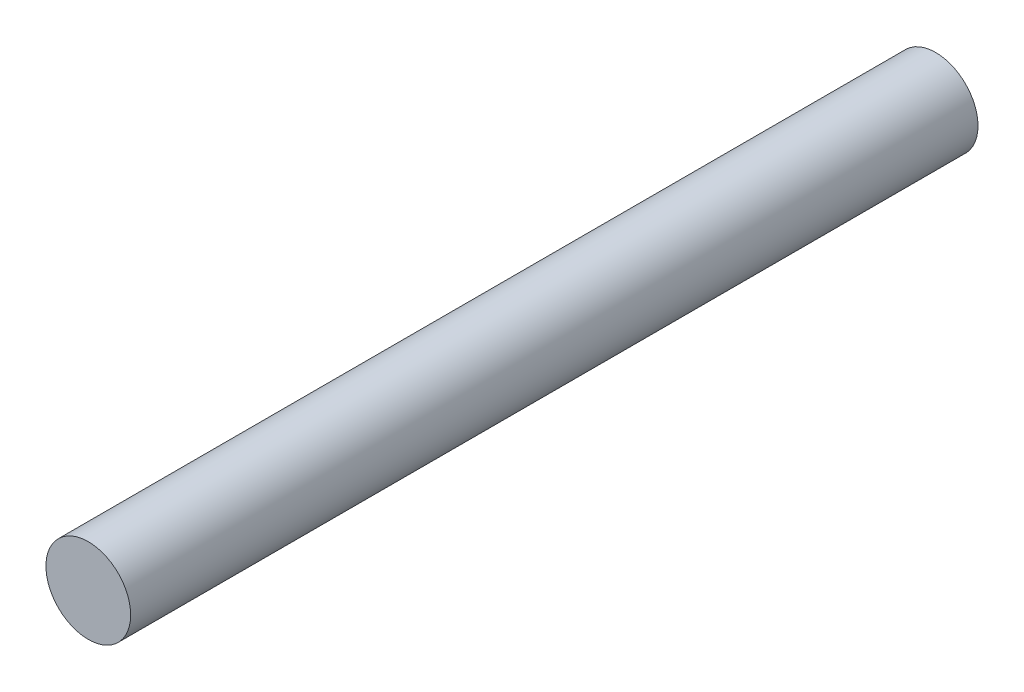
ISO-10303-21;
HEADER;
FILE_DESCRIPTION(('STEP AP214'),'2;1');
FILE_NAME('part.step','',(''),(''),'','','');
FILE_SCHEMA(('AUTOMOTIVE_DESIGN { 1 0 10303 214 1 1 1 1 }'));
ENDSEC;
DATA;
#1=APPLICATION_CONTEXT('core data for automotive mechanical design processes');
#2=APPLICATION_PROTOCOL_DEFINITION('international standard','automotive_design',2000,#1);
#3=PRODUCT_CONTEXT('',#1,'mechanical');
#4=PRODUCT('Part','Part','',(#3));
#5=PRODUCT_RELATED_PRODUCT_CATEGORY('part','',(#4));
#6=PRODUCT_DEFINITION_FORMATION('','',#4);
#7=PRODUCT_DEFINITION_CONTEXT('part definition',#1,'design');
#8=PRODUCT_DEFINITION('design','',#6,#7);
#9=PRODUCT_DEFINITION_SHAPE('','',#8);
#10=(LENGTH_UNIT() NAMED_UNIT(*) SI_UNIT(.MILLI.,.METRE.));
#11=(NAMED_UNIT(*) PLANE_ANGLE_UNIT() SI_UNIT($,.RADIAN.));
#12=(NAMED_UNIT(*) SI_UNIT($,.STERADIAN.) SOLID_ANGLE_UNIT());
#13=UNCERTAINTY_MEASURE_WITH_UNIT(LENGTH_MEASURE(1.E-05),#10,'distance_accuracy_value','');
#14=(GEOMETRIC_REPRESENTATION_CONTEXT(3) GLOBAL_UNCERTAINTY_ASSIGNED_CONTEXT((#13)) GLOBAL_UNIT_ASSIGNED_CONTEXT((#10,
#11,#12)) REPRESENTATION_CONTEXT('',''));
#15=CARTESIAN_POINT('',(0.,0.,0.));
#16=DIRECTION('',(0.,0.,1.));
#17=DIRECTION('',(1.,0.,0.));
#18=AXIS2_PLACEMENT_3D('',#15,#16,#17);
#19=CARTESIAN_POINT('',(0.,0.,60.));
#20=DIRECTION('',(0.,0.,-1.));
#21=DIRECTION('',(-1.,0.,0.));
#22=AXIS2_PLACEMENT_3D('',#19,#20,#21);
#23=CYLINDRICAL_SURFACE('',#22,3.);
#24=CARTESIAN_POINT('',(0.,0.,60.));
#25=DIRECTION('',(0.,0.,1.));
#26=DIRECTION('',(1.,0.,0.));
#27=AXIS2_PLACEMENT_3D('',#24,#25,#26);
#28=CIRCLE('',#27,3.);
#29=CARTESIAN_POINT('',(3.,0.,60.));
#30=VERTEX_POINT('',#29);
#31=EDGE_CURVE('E11',#30,#30,#28,.T.);
#32=ORIENTED_EDGE('',*,*,#31,.F.);
#33=EDGE_LOOP('',(#32));
#34=FACE_BOUND('',#33,.T.);
#35=CARTESIAN_POINT('',(0.,0.,0.));
#36=DIRECTION('',(0.,0.,1.));
#37=DIRECTION('',(1.,0.,0.));
#38=AXIS2_PLACEMENT_3D('',#35,#36,#37);
#39=CIRCLE('',#38,3.);
#40=CARTESIAN_POINT('',(3.,0.,0.));
#41=VERTEX_POINT('',#40);
#42=EDGE_CURVE('E42',#41,#41,#39,.T.);
#43=ORIENTED_EDGE('',*,*,#42,.T.);
#44=EDGE_LOOP('',(#43));
#45=FACE_BOUND('',#44,.T.);
#46=ADVANCED_FACE('F39',(#34,#45),#23,.T.);
#47=CARTESIAN_POINT('',(0.,0.,60.));
#48=DIRECTION('',(0.,0.,1.));
#49=DIRECTION('',(1.,0.,0.));
#50=AXIS2_PLACEMENT_3D('',#47,#48,#49);
#51=PLANE('',#50);
#52=ORIENTED_EDGE('',*,*,#31,.T.);
#53=EDGE_LOOP('',(#52));
#54=FACE_BOUND('',#53,.T.);
#55=ADVANCED_FACE('F72',(#54),#51,.T.);
#56=CARTESIAN_POINT('',(0.,0.,0.));
#57=DIRECTION('',(0.,0.,1.));
#58=DIRECTION('',(1.,0.,0.));
#59=AXIS2_PLACEMENT_3D('',#56,#57,#58);
#60=PLANE('',#59);
#61=CARTESIAN_POINT('',(0.,0.,0.));
#62=DIRECTION('',(0.,0.,-1.));
#63=DIRECTION('',(-1.,0.,0.));
#64=AXIS2_PLACEMENT_3D('',#61,#62,#63);
#65=CIRCLE('',#64,2.025);
#66=CARTESIAN_POINT('',(-2.025,0.,0.));
#67=VERTEX_POINT('',#66);
#68=EDGE_CURVE('E62',#67,#67,#65,.T.);
#69=ORIENTED_EDGE('',*,*,#68,.F.);
#70=EDGE_LOOP('',(#69));
#71=FACE_BOUND('',#70,.T.);
#72=ORIENTED_EDGE('',*,*,#42,.F.);
#73=EDGE_LOOP('',(#72));
#74=FACE_BOUND('',#73,.T.);
#75=ADVANCED_FACE('F52',(#71,#74),#60,.F.);
#76=CARTESIAN_POINT('',(0.,0.,20.));
#77=DIRECTION('',(0.,0.,-1.));
#78=DIRECTION('',(-1.,0.,0.));
#79=AXIS2_PLACEMENT_3D('',#76,#77,#78);
#80=CONICAL_SURFACE('',#79,1.65,1.02974425867665);
#81=CARTESIAN_POINT('',(0.,0.,20.9914200213955));
#82=VERTEX_POINT('',#81);
#83=VERTEX_LOOP('',#82);
#84=FACE_BOUND('',#83,.T.);
#85=CARTESIAN_POINT('',(0.,0.,20.));
#86=DIRECTION('',(0.,0.,-1.));
#87=DIRECTION('',(-1.,0.,0.));
#88=AXIS2_PLACEMENT_3D('',#85,#86,#87);
#89=CIRCLE('',#88,1.65);
#90=CARTESIAN_POINT('',(-1.65,0.,20.));
#91=VERTEX_POINT('',#90);
#92=EDGE_CURVE('E56',#91,#91,#89,.T.);
#93=ORIENTED_EDGE('',*,*,#92,.T.);
#94=EDGE_LOOP('',(#93));
#95=FACE_BOUND('',#94,.T.);
#96=ADVANCED_FACE('F48',(#84,#95),#80,.F.);
#97=CARTESIAN_POINT('',(0.,0.,0.));
#98=DIRECTION('',(0.,0.,-1.));
#99=DIRECTION('',(-1.,0.,0.));
#100=AXIS2_PLACEMENT_3D('',#97,#98,#99);
#101=CYLINDRICAL_SURFACE('',#100,1.65);
#102=ORIENTED_EDGE('',*,*,#92,.F.);
#103=EDGE_LOOP('',(#102));
#104=FACE_BOUND('',#103,.T.);
#105=CARTESIAN_POINT('',(0.,0.,0.374999999999999));
#106=DIRECTION('',(0.,0.,-1.));
#107=DIRECTION('',(-1.,0.,0.));
#108=AXIS2_PLACEMENT_3D('',#105,#106,#107);
#109=CIRCLE('',#108,1.65);
#110=CARTESIAN_POINT('',(-1.65,0.,0.374999999999999));
#111=VERTEX_POINT('',#110);
#112=EDGE_CURVE('E58',#111,#111,#109,.T.);
#113=ORIENTED_EDGE('',*,*,#112,.T.);
#114=EDGE_LOOP('',(#113));
#115=FACE_BOUND('',#114,.T.);
#116=ADVANCED_FACE('F51',(#104,#115),#101,.F.);
#117=CARTESIAN_POINT('',(0.,0.,0.));
#118=DIRECTION('',(0.,0.,-1.));
#119=DIRECTION('',(-1.,0.,0.));
#120=AXIS2_PLACEMENT_3D('',#117,#118,#119);
#121=CONICAL_SURFACE('',#120,2.025,0.785398163397452);
#122=ORIENTED_EDGE('',*,*,#112,.F.);
#123=EDGE_LOOP('',(#122));
#124=FACE_BOUND('',#123,.T.);
#125=ORIENTED_EDGE('',*,*,#68,.T.);
#126=EDGE_LOOP('',(#125));
#127=FACE_BOUND('',#126,.T.);
#128=ADVANCED_FACE('F68',(#124,#127),#121,.F.);
#129=CLOSED_SHELL('',(#46,#55,#75,#96,#116,#128));
#130=MANIFOLD_SOLID_BREP('B2',#129);
#131=ADVANCED_BREP_SHAPE_REPRESENTATION('',(#18,#130),#14);
#132=SHAPE_DEFINITION_REPRESENTATION(#9,#131);
ENDSEC;
END-ISO-10303-21;
